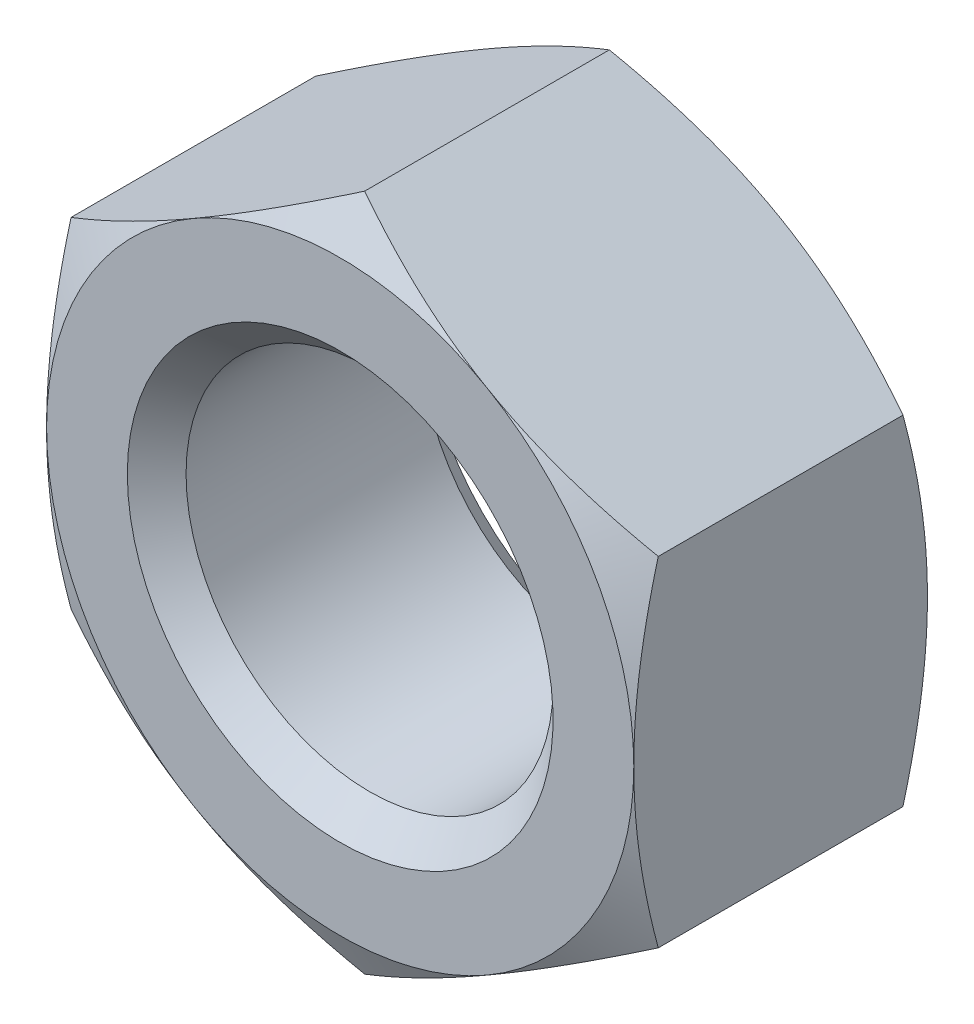
ISO-10303-21;
HEADER;
FILE_DESCRIPTION(('STEP AP214'),'2;1');
FILE_NAME('part.step','',(''),(''),'','','');
FILE_SCHEMA(('AUTOMOTIVE_DESIGN { 1 0 10303 214 1 1 1 1 }'));
ENDSEC;
DATA;
#1=APPLICATION_CONTEXT('core data for automotive mechanical design processes');
#2=APPLICATION_PROTOCOL_DEFINITION('international standard','automotive_design',2000,#1);
#3=PRODUCT_CONTEXT('',#1,'mechanical');
#4=PRODUCT('Part','Part','',(#3));
#5=PRODUCT_RELATED_PRODUCT_CATEGORY('part','',(#4));
#6=PRODUCT_DEFINITION_FORMATION('','',#4);
#7=PRODUCT_DEFINITION_CONTEXT('part definition',#1,'design');
#8=PRODUCT_DEFINITION('design','',#6,#7);
#9=PRODUCT_DEFINITION_SHAPE('','',#8);
#10=(LENGTH_UNIT() NAMED_UNIT(*) SI_UNIT(.MILLI.,.METRE.));
#11=(NAMED_UNIT(*) PLANE_ANGLE_UNIT() SI_UNIT($,.RADIAN.));
#12=(NAMED_UNIT(*) SI_UNIT($,.STERADIAN.) SOLID_ANGLE_UNIT());
#13=UNCERTAINTY_MEASURE_WITH_UNIT(LENGTH_MEASURE(1.E-05),#10,'distance_accuracy_value','');
#14=(GEOMETRIC_REPRESENTATION_CONTEXT(3) GLOBAL_UNCERTAINTY_ASSIGNED_CONTEXT((#13)) GLOBAL_UNIT_ASSIGNED_CONTEXT((#10,
#11,#12)) REPRESENTATION_CONTEXT('',''));
#15=CARTESIAN_POINT('',(0.,0.,0.));
#16=DIRECTION('',(0.,0.,1.));
#17=DIRECTION('',(1.,0.,0.));
#18=AXIS2_PLACEMENT_3D('',#15,#16,#17);
#19=CARTESIAN_POINT('',(0.,0.,4.));
#20=DIRECTION('',(0.,0.,1.));
#21=DIRECTION('',(1.,0.,0.));
#22=AXIS2_PLACEMENT_3D('',#19,#20,#21);
#23=PLANE('',#22);
#24=CARTESIAN_POINT('',(0.,0.,4.));
#25=DIRECTION('',(0.,0.,-1.));
#26=DIRECTION('',(-1.,0.,0.));
#27=AXIS2_PLACEMENT_3D('',#24,#25,#26);
#28=CIRCLE('',#27,2.9);
#29=CARTESIAN_POINT('',(-2.9,0.,4.));
#30=VERTEX_POINT('',#29);
#31=EDGE_CURVE('E160',#30,#30,#28,.T.);
#32=ORIENTED_EDGE('',*,*,#31,.T.);
#33=EDGE_LOOP('',(#32));
#34=FACE_BOUND('',#33,.T.);
#35=CARTESIAN_POINT('',(0.,0.,4.));
#36=DIRECTION('',(0.,0.,-1.));
#37=DIRECTION('',(-1.,0.,0.));
#38=AXIS2_PLACEMENT_3D('',#35,#36,#37);
#39=CIRCLE('',#38,4.);
#40=CARTESIAN_POINT('',(4.,0.,4.));
#41=VERTEX_POINT('',#40);
#42=CARTESIAN_POINT('',(2.,-3.46410161513776,4.));
#43=VERTEX_POINT('',#42);
#44=EDGE_CURVE('E304',#41,#43,#39,.T.);
#45=ORIENTED_EDGE('',*,*,#44,.F.);
#46=CARTESIAN_POINT('',(2.,3.46410161513775,4.));
#47=VERTEX_POINT('',#46);
#48=EDGE_CURVE('E306',#47,#41,#39,.T.);
#49=ORIENTED_EDGE('',*,*,#48,.F.);
#50=CARTESIAN_POINT('',(-2.,3.46410161513775,4.));
#51=VERTEX_POINT('',#50);
#52=EDGE_CURVE('E312',#51,#47,#39,.T.);
#53=ORIENTED_EDGE('',*,*,#52,.F.);
#54=CARTESIAN_POINT('',(-4.,0.,4.));
#55=VERTEX_POINT('',#54);
#56=EDGE_CURVE('E314',#55,#51,#39,.T.);
#57=ORIENTED_EDGE('',*,*,#56,.F.);
#58=CARTESIAN_POINT('',(-2.,-3.46410161513775,4.));
#59=VERTEX_POINT('',#58);
#60=EDGE_CURVE('E313',#59,#55,#39,.T.);
#61=ORIENTED_EDGE('',*,*,#60,.F.);
#62=EDGE_CURVE('E308',#43,#59,#39,.T.);
#63=ORIENTED_EDGE('',*,*,#62,.F.);
#64=EDGE_LOOP('',(#45,#49,#53,#57,#61,#63));
#65=FACE_BOUND('',#64,.T.);
#66=ADVANCED_FACE('F33',(#34,#65),#23,.T.);
#67=CARTESIAN_POINT('',(0.,0.,0.));
#68=DIRECTION('',(0.,0.,1.));
#69=DIRECTION('',(1.,0.,0.));
#70=AXIS2_PLACEMENT_3D('',#67,#68,#69);
#71=PLANE('',#70);
#72=CARTESIAN_POINT('',(0.,0.,0.));
#73=DIRECTION('',(0.,0.,-1.));
#74=DIRECTION('',(-1.,0.,0.));
#75=AXIS2_PLACEMENT_3D('',#72,#73,#74);
#76=CIRCLE('',#75,2.9);
#77=CARTESIAN_POINT('',(-2.9,0.,0.));
#78=VERTEX_POINT('',#77);
#79=EDGE_CURVE('E294',#78,#78,#76,.T.);
#80=ORIENTED_EDGE('',*,*,#79,.F.);
#81=EDGE_LOOP('',(#80));
#82=FACE_BOUND('',#81,.T.);
#83=CARTESIAN_POINT('',(0.,0.,0.));
#84=DIRECTION('',(0.,0.,-1.));
#85=DIRECTION('',(-1.,0.,0.));
#86=AXIS2_PLACEMENT_3D('',#83,#84,#85);
#87=CIRCLE('',#86,4.);
#88=CARTESIAN_POINT('',(2.,3.46410161513776,0.));
#89=VERTEX_POINT('',#88);
#90=CARTESIAN_POINT('',(4.,0.,0.));
#91=VERTEX_POINT('',#90);
#92=EDGE_CURVE('E356',#89,#91,#87,.T.);
#93=ORIENTED_EDGE('',*,*,#92,.T.);
#94=CARTESIAN_POINT('',(2.,-3.46410161513776,0.));
#95=VERTEX_POINT('',#94);
#96=EDGE_CURVE('E158',#91,#95,#87,.T.);
#97=ORIENTED_EDGE('',*,*,#96,.T.);
#98=CARTESIAN_POINT('',(-2.,-3.46410161513775,0.));
#99=VERTEX_POINT('',#98);
#100=EDGE_CURVE('E156',#95,#99,#87,.T.);
#101=ORIENTED_EDGE('',*,*,#100,.T.);
#102=CARTESIAN_POINT('',(-4.,0.,0.));
#103=VERTEX_POINT('',#102);
#104=EDGE_CURVE('E54',#99,#103,#87,.T.);
#105=ORIENTED_EDGE('',*,*,#104,.T.);
#106=CARTESIAN_POINT('',(-2.,3.46410161513775,0.));
#107=VERTEX_POINT('',#106);
#108=EDGE_CURVE('E130',#103,#107,#87,.T.);
#109=ORIENTED_EDGE('',*,*,#108,.T.);
#110=EDGE_CURVE('E137',#107,#89,#87,.T.);
#111=ORIENTED_EDGE('',*,*,#110,.T.);
#112=EDGE_LOOP('',(#93,#97,#101,#105,#109,#111));
#113=FACE_BOUND('',#112,.T.);
#114=ADVANCED_FACE('F154',(#82,#113),#71,.F.);
#115=CARTESIAN_POINT('',(-4.,-2.3094010767585,4.));
#116=DIRECTION('',(0.5,0.866025403784439,0.));
#117=DIRECTION('',(-0.866025403784439,0.5,0.));
#118=AXIS2_PLACEMENT_3D('',#115,#116,#117);
#119=PLANE('',#118);
#120=DIRECTION('',(0.,0.,-1.));
#121=VECTOR('',#120,1.);
#122=CARTESIAN_POINT('',(-4.,-2.3094010767585,4.));
#123=LINE('',#122,#121);
#124=CARTESIAN_POINT('',(-4.,-2.3094010767585,3.66666666666667));
#125=VERTEX_POINT('',#124);
#126=CARTESIAN_POINT('',(-4.,-2.3094010767585,0.333333333333333));
#127=VERTEX_POINT('',#126);
#128=EDGE_CURVE('E241',#125,#127,#123,.T.);
#129=ORIENTED_EDGE('',*,*,#128,.T.);
#130=CARTESIAN_POINT('',(-4.0002,-2.30928560670466,0.333395536512599));
#131=CARTESIAN_POINT('',(-3.82544343142338,-2.41018135861503,0.279023843196621));
#132=CARTESIAN_POINT('',(-3.64937399613057,-2.5118350944774,0.229608401689969));
#133=CARTESIAN_POINT('',(-3.29459567533502,-2.71666645349135,0.143312188818609));
#134=CARTESIAN_POINT('',(-3.11588215442706,-2.81984675289539,0.106457085569042));
#135=CARTESIAN_POINT('',(-2.76037977464407,-3.02509614756065,0.0487738588017574));
#136=CARTESIAN_POINT('',(-2.58363220310694,-3.12714140556623,0.0276180480037177));
#137=CARTESIAN_POINT('',(-2.22938827138522,-3.33166423490456,0.00195261477935686));
#138=CARTESIAN_POINT('',(-2.05189286991919,-3.43414125272089,-0.0025741301020054));
#139=CARTESIAN_POINT('',(-1.71767356485902,-3.62710285846574,0.00493896436130907));
#140=CARTESIAN_POINT('',(-1.56091561654162,-3.71760710212441,0.0151278787991774));
#141=CARTESIAN_POINT('',(-1.24828236106871,-3.89810599632933,0.0480626941169735));
#142=CARTESIAN_POINT('',(-1.09240785848224,-3.98810018235742,0.0708186133818323));
#143=CARTESIAN_POINT('',(-0.779187615647182,-4.16893797387388,0.127951453713286));
#144=CARTESIAN_POINT('',(-0.621872503303762,-4.25976389633295,0.162546437931521));
#145=CARTESIAN_POINT('',(-0.30930983110621,-4.44022203926484,0.241286173357489));
#146=CARTESIAN_POINT('',(-0.154059223150336,-4.52985601956002,0.285414666218662));
#147=CARTESIAN_POINT('',(0.000199999999999681,-4.61891762357084,0.3333955365126));
#148=B_SPLINE_CURVE_WITH_KNOTS('',3,(#130,#131,#132,#133,#134,#135,#136,#137,#138,#139,#140,
#141,#142,#143,#144,#145,#146,#147),.UNSPECIFIED.,.F.,.F.,(4,2,2,2,2,2,2,2,4),(0.,
0.627167133338425,1.25560835649169,1.8705318494423,2.48482199618759,3.02824583676971,
3.57210352015798,4.12657182752052,4.68010191140895),.UNSPECIFIED.);
#149=EDGE_CURVE('E142',#127,#99,#148,.T.);
#150=ORIENTED_EDGE('',*,*,#149,.T.);
#151=CARTESIAN_POINT('',(0.,-4.61880215351701,0.333333333333333));
#152=VERTEX_POINT('',#151);
#153=EDGE_CURVE('E207',#99,#152,#148,.T.);
#154=ORIENTED_EDGE('',*,*,#153,.T.);
#155=DIRECTION('',(0.,0.,-1.));
#156=VECTOR('',#155,1.);
#157=CARTESIAN_POINT('',(0.,-4.61880215351701,4.));
#158=LINE('',#157,#156);
#159=CARTESIAN_POINT('',(0.,-4.61880215351701,3.66666666666667));
#160=VERTEX_POINT('',#159);
#161=EDGE_CURVE('E252',#160,#152,#158,.T.);
#162=ORIENTED_EDGE('',*,*,#161,.F.);
#163=CARTESIAN_POINT('',(0.000200000000000024,-4.61891762357084,3.6666044634874));
#164=CARTESIAN_POINT('',(-0.174556568576619,-4.51802187166048,3.72097615680338));
#165=CARTESIAN_POINT('',(-0.350626003869434,-4.41636813579811,3.77039159831003));
#166=CARTESIAN_POINT('',(-0.705404324664975,-4.21153677678416,3.85668781118139));
#167=CARTESIAN_POINT('',(-0.884117845572943,-4.10835647738012,3.89354291443096));
#168=CARTESIAN_POINT('',(-1.23962022535593,-3.90310708271486,3.95122614119824));
#169=CARTESIAN_POINT('',(-1.41636779689306,-3.80106182470928,3.97238195199628));
#170=CARTESIAN_POINT('',(-1.77061172861478,-3.59653899537095,3.99804738522064));
#171=CARTESIAN_POINT('',(-1.94810713008081,-3.49406197755462,4.00257413010201));
#172=CARTESIAN_POINT('',(-2.28232643514098,-3.30110037180976,3.99506103563869));
#173=CARTESIAN_POINT('',(-2.43908438345838,-3.2105961281511,3.98487212120082));
#174=CARTESIAN_POINT('',(-2.75171763893129,-3.03009723394618,3.95193730588303));
#175=CARTESIAN_POINT('',(-2.90759214151776,-2.94010304791809,3.92918138661817));
#176=CARTESIAN_POINT('',(-3.22081238435282,-2.75926525640163,3.87204854628671));
#177=CARTESIAN_POINT('',(-3.37812749669624,-2.66843933394256,3.83745356206848));
#178=CARTESIAN_POINT('',(-3.69069016889379,-2.48798119101067,3.75871382664251));
#179=CARTESIAN_POINT('',(-3.84594077684966,-2.39834721071549,3.71458533378134));
#180=CARTESIAN_POINT('',(-4.0002,-2.30928560670466,3.6666044634874));
#181=B_SPLINE_CURVE_WITH_KNOTS('',3,(#163,#164,#165,#166,#167,#168,#169,#170,#171,#172,#173,
#174,#175,#176,#177,#178,#179,#180),.UNSPECIFIED.,.F.,.F.,(4,2,2,2,2,2,2,2,4),(0.,
0.627167133338425,1.25560835649169,1.8705318494423,2.48482199618759,3.02824583676971,
3.57210352015798,4.12657182752052,4.68010191140895),.UNSPECIFIED.);
#182=EDGE_CURVE('E327',#160,#59,#181,.T.);
#183=ORIENTED_EDGE('',*,*,#182,.T.);
#184=EDGE_CURVE('E321',#59,#125,#181,.T.);
#185=ORIENTED_EDGE('',*,*,#184,.T.);
#186=EDGE_LOOP('',(#129,#150,#154,#162,#183,#185));
#187=FACE_BOUND('',#186,.T.);
#188=ADVANCED_FACE('F35',(#187),#119,.F.);
#189=CARTESIAN_POINT('',(0.,-4.61880215351701,4.));
#190=DIRECTION('',(-0.5,0.866025403784439,0.));
#191=DIRECTION('',(-0.866025403784439,-0.5,0.));
#192=AXIS2_PLACEMENT_3D('',#189,#190,#191);
#193=PLANE('',#192);
#194=ORIENTED_EDGE('',*,*,#161,.T.);
#195=CARTESIAN_POINT('',(-0.000200000000000029,-4.61891762357084,0.3333955365126));
#196=CARTESIAN_POINT('',(0.17455656857662,-4.51802187166048,0.279023843196621));
#197=CARTESIAN_POINT('',(0.350626003869434,-4.41636813579811,0.229608401689969));
#198=CARTESIAN_POINT('',(0.705404324664975,-4.21153677678416,0.143312188818609));
#199=CARTESIAN_POINT('',(0.884117845572943,-4.10835647738011,0.106457085569042));
#200=CARTESIAN_POINT('',(1.23962022535593,-3.90310708271486,0.0487738588017579));
#201=CARTESIAN_POINT('',(1.41636779689306,-3.80106182470928,0.0276180480037185));
#202=CARTESIAN_POINT('',(1.77061172861478,-3.59653899537095,0.00195261477935759));
#203=CARTESIAN_POINT('',(1.94810713008081,-3.49406197755462,-0.00257413010200502));
#204=CARTESIAN_POINT('',(2.28232643514098,-3.30110037180977,0.00493896436130913));
#205=CARTESIAN_POINT('',(2.43908438345838,-3.2105961281511,0.0151278787991775));
#206=CARTESIAN_POINT('',(2.7517176389313,-3.03009723394618,0.0480626941169736));
#207=CARTESIAN_POINT('',(2.90759214151776,-2.94010304791809,0.0708186133818323));
#208=CARTESIAN_POINT('',(3.22081238435282,-2.75926525640163,0.127951453713286));
#209=CARTESIAN_POINT('',(3.37812749669624,-2.66843933394256,0.162546437931521));
#210=CARTESIAN_POINT('',(3.69069016889379,-2.48798119101067,0.241286173357489));
#211=CARTESIAN_POINT('',(3.84594077684966,-2.3983472107155,0.285414666218662));
#212=CARTESIAN_POINT('',(4.0002,-2.30928560670467,0.3333955365126));
#213=B_SPLINE_CURVE_WITH_KNOTS('',3,(#195,#196,#197,#198,#199,#200,#201,#202,#203,#204,#205,
#206,#207,#208,#209,#210,#211,#212),.UNSPECIFIED.,.F.,.F.,(4,2,2,2,2,2,2,2,4),(0.,
0.627167133338425,1.25560835649169,1.8705318494423,2.48482199618759,3.02824583676971,
3.57210352015798,4.12657182752052,4.68010191140895),.UNSPECIFIED.);
#214=EDGE_CURVE('E206',#152,#95,#213,.T.);
#215=ORIENTED_EDGE('',*,*,#214,.T.);
#216=CARTESIAN_POINT('',(4.,-2.3094010767585,0.333333333333333));
#217=VERTEX_POINT('',#216);
#218=EDGE_CURVE('E201',#95,#217,#213,.T.);
#219=ORIENTED_EDGE('',*,*,#218,.T.);
#220=DIRECTION('',(0.,0.,-1.));
#221=VECTOR('',#220,1.);
#222=CARTESIAN_POINT('',(4.,-2.3094010767585,4.));
#223=LINE('',#222,#221);
#224=CARTESIAN_POINT('',(4.,-2.3094010767585,3.66666666666667));
#225=VERTEX_POINT('',#224);
#226=EDGE_CURVE('E250',#225,#217,#223,.T.);
#227=ORIENTED_EDGE('',*,*,#226,.F.);
#228=CARTESIAN_POINT('',(4.0002,-2.30928560670467,3.6666044634874));
#229=CARTESIAN_POINT('',(3.82544343142338,-2.41018135861503,3.72097615680338));
#230=CARTESIAN_POINT('',(3.64937399613056,-2.51183509447741,3.77039159831003));
#231=CARTESIAN_POINT('',(3.29459567533502,-2.71666645349136,3.85668781118139));
#232=CARTESIAN_POINT('',(3.11588215442706,-2.8198467528954,3.89354291443096));
#233=CARTESIAN_POINT('',(2.76037977464407,-3.02509614756066,3.95122614119824));
#234=CARTESIAN_POINT('',(2.58363220310694,-3.12714140556623,3.97238195199628));
#235=CARTESIAN_POINT('',(2.22938827138522,-3.33166423490456,3.99804738522064));
#236=CARTESIAN_POINT('',(2.05189286991919,-3.43414125272089,4.002574130102));
#237=CARTESIAN_POINT('',(1.71767356485902,-3.62710285846575,3.99506103563869));
#238=CARTESIAN_POINT('',(1.56091561654162,-3.71760710212441,3.98487212120082));
#239=CARTESIAN_POINT('',(1.2482823610687,-3.89810599632933,3.95193730588303));
#240=CARTESIAN_POINT('',(1.09240785848224,-3.98810018235742,3.92918138661817));
#241=CARTESIAN_POINT('',(0.779187615647182,-4.16893797387388,3.87204854628671));
#242=CARTESIAN_POINT('',(0.621872503303762,-4.25976389633295,3.83745356206848));
#243=CARTESIAN_POINT('',(0.30930983110621,-4.44022203926484,3.75871382664251));
#244=CARTESIAN_POINT('',(0.154059223150336,-4.52985601956002,3.71458533378134));
#245=CARTESIAN_POINT('',(-0.000199999999999755,-4.61891762357084,3.6666044634874));
#246=B_SPLINE_CURVE_WITH_KNOTS('',3,(#228,#229,#230,#231,#232,#233,#234,#235,#236,#237,#238,
#239,#240,#241,#242,#243,#244,#245),.UNSPECIFIED.,.F.,.F.,(4,2,2,2,2,2,2,2,4),(0.,
0.627167133338426,1.25560835649169,1.8705318494423,2.48482199618759,3.02824583676971,
3.57210352015798,4.12657182752051,4.68010191140894),.UNSPECIFIED.);
#247=EDGE_CURVE('E227',#225,#43,#246,.T.);
#248=ORIENTED_EDGE('',*,*,#247,.T.);
#249=EDGE_CURVE('E220',#43,#160,#246,.T.);
#250=ORIENTED_EDGE('',*,*,#249,.T.);
#251=EDGE_LOOP('',(#194,#215,#219,#227,#248,#250));
#252=FACE_BOUND('',#251,.T.);
#253=ADVANCED_FACE('F212',(#252),#193,.F.);
#254=CARTESIAN_POINT('',(4.,-2.3094010767585,4.));
#255=DIRECTION('',(-1.,0.,0.));
#256=DIRECTION('',(0.,-1.,0.));
#257=AXIS2_PLACEMENT_3D('',#254,#255,#256);
#258=PLANE('',#257);
#259=ORIENTED_EDGE('',*,*,#226,.T.);
#260=CARTESIAN_POINT('',(4.,-6.12465606060113,1.78578859034952));
#261=CARTESIAN_POINT('',(4.,-5.94807272678306,1.70617076017397));
#262=CARTESIAN_POINT('',(4.,-5.77111437773541,1.62736962172036));
#263=CARTESIAN_POINT('',(4.,-5.41624686185262,1.47186426207372));
#264=CARTESIAN_POINT('',(4.,-5.23833755085189,1.39516037025972));
#265=CARTESIAN_POINT('',(4.,-4.88052144234326,1.2439574965174));
#266=CARTESIAN_POINT('',(4.,-4.70060909498336,1.16947160073948));
#267=CARTESIAN_POINT('',(4.,-4.33946420476368,1.0237846613623));
#268=CARTESIAN_POINT('',(4.,-4.15823172405733,0.952583464258251));
#269=CARTESIAN_POINT('',(4.,-3.79251879461095,0.813698662988814));
#270=CARTESIAN_POINT('',(4.,-3.6080237995005,0.746053155399669));
#271=CARTESIAN_POINT('',(4.,-3.23711156127834,0.61615488608717));
#272=CARTESIAN_POINT('',(4.,-3.05069413780278,0.553902635610596));
#273=CARTESIAN_POINT('',(4.,-2.6760277018865,0.43643135992104));
#274=CARTESIAN_POINT('',(4.,-2.48778289377823,0.381199059142228));
#275=CARTESIAN_POINT('',(4.,-2.10895429136712,0.279535341469906));
#276=CARTESIAN_POINT('',(4.,-1.91837114965874,0.233101525974141));
#277=CARTESIAN_POINT('',(4.,-1.5347598212881,0.151213238734758));
#278=CARTESIAN_POINT('',(4.,-1.34173094133917,0.115761956092511));
#279=CARTESIAN_POINT('',(4.,-0.95364837830096,0.0581148169951025));
#280=CARTESIAN_POINT('',(4.,-0.758594605555516,0.0359195500451328));
#281=CARTESIAN_POINT('',(4.,-0.368329490347497,0.00662630185783796));
#282=CARTESIAN_POINT('',(4.,-0.173124030914448,-0.000548140304414855));
#283=CARTESIAN_POINT('',(4.,0.217189649465562,0.000613513643077368));
#284=CARTESIAN_POINT('',(4.,0.412297882158566,0.00894507796775398));
#285=CARTESIAN_POINT('',(4.,0.758770311592138,0.0369241468082312));
#286=CARTESIAN_POINT('',(4.,0.91037798636888,0.053701463239071));
#287=CARTESIAN_POINT('',(4.,1.21248172184858,0.0954401006786356));
#288=CARTESIAN_POINT('',(4.,1.36297756793462,0.120402961611947));
#289=CARTESIAN_POINT('',(4.,1.66274837052041,0.177522439679809));
#290=CARTESIAN_POINT('',(4.,1.81202182875218,0.209686816202598));
#291=CARTESIAN_POINT('',(4.,2.10909736140954,0.280116855929456));
#292=CARTESIAN_POINT('',(4.,2.2568995370089,0.318382096480732));
#293=CARTESIAN_POINT('',(4.,2.55450258053101,0.400961452917501));
#294=CARTESIAN_POINT('',(4.,2.70426986908358,0.445395653954795));
#295=CARTESIAN_POINT('',(4.,3.00231082032815,0.538630452223047));
#296=CARTESIAN_POINT('',(4.,3.15058548979997,0.587427851355468));
#297=CARTESIAN_POINT('',(4.,3.44500555360459,0.688321047172834));
#298=CARTESIAN_POINT('',(4.,3.59115838834901,0.740395267271637));
#299=CARTESIAN_POINT('',(4.,3.88244574527926,0.847521971689482));
#300=CARTESIAN_POINT('',(4.,4.02757977693788,0.90257579253939));
#301=CARTESIAN_POINT('',(4.,4.17224291316199,0.958804969957559));
#302=B_SPLINE_CURVE_WITH_KNOTS('',3,(#260,#261,#262,#263,#264,#265,#266,#267,#268,#269,#270,
#271,#272,#273,#274,#275,#276,#277,#278,#279,#280,#281,#282,#283,#284,#285,#286,#287,#288,#289,
#290,#291,#292,#293,#294,#295,#296,#297,#298,#299,#300,#301),.UNSPECIFIED.,.F.,.F.,(4,2,2,2,2,2,
2,2,2,2,2,2,2,2,2,2,2,2,2,2,4),(0.,0.581114780286608,1.1623203082163,1.74645999055631,
2.33057234641384,2.92002320524669,3.50952987930703,4.09790459122561,4.68611867165817,
5.2745033975901,5.86291428749447,6.44832261736047,7.03355988266934,7.49092720644395,
7.94838062292147,8.40632932234503,8.86424630998788,9.33282419558873,9.80106139929137,
10.2664856243637,10.7321203790827),.UNSPECIFIED.);
#303=EDGE_CURVE('E62',#217,#91,#302,.T.);
#304=ORIENTED_EDGE('',*,*,#303,.T.);
#305=CARTESIAN_POINT('',(4.,2.3094010767585,0.333333333333333));
#306=VERTEX_POINT('',#305);
#307=EDGE_CURVE('E195',#91,#306,#302,.T.);
#308=ORIENTED_EDGE('',*,*,#307,.T.);
#309=DIRECTION('',(0.,0.,-1.));
#310=VECTOR('',#309,1.);
#311=CARTESIAN_POINT('',(4.,2.3094010767585,4.));
#312=LINE('',#311,#310);
#313=CARTESIAN_POINT('',(4.,2.3094010767585,3.66666666666667));
#314=VERTEX_POINT('',#313);
#315=EDGE_CURVE('E247',#314,#306,#312,.T.);
#316=ORIENTED_EDGE('',*,*,#315,.F.);
#317=CARTESIAN_POINT('',(4.,-6.12465606060113,2.21421140965048));
#318=CARTESIAN_POINT('',(4.,-5.94807272678306,2.29382923982603));
#319=CARTESIAN_POINT('',(4.,-5.77111437773541,2.37263037827964));
#320=CARTESIAN_POINT('',(4.,-5.41624686185261,2.52813573792628));
#321=CARTESIAN_POINT('',(4.,-5.23833755085189,2.60483962974028));
#322=CARTESIAN_POINT('',(4.,-4.88052144234326,2.7560425034826));
#323=CARTESIAN_POINT('',(4.,-4.70060909498336,2.83052839926052));
#324=CARTESIAN_POINT('',(4.,-4.33946420476367,2.9762153386377));
#325=CARTESIAN_POINT('',(4.,-4.15823172405732,3.04741653574175));
#326=CARTESIAN_POINT('',(4.,-3.79251879461095,3.18630133701119));
#327=CARTESIAN_POINT('',(4.,-3.6080237995005,3.25394684460033));
#328=CARTESIAN_POINT('',(4.,-3.23711156127834,3.38384511391283));
#329=CARTESIAN_POINT('',(4.,-3.05069413780278,3.4460973643894));
#330=CARTESIAN_POINT('',(4.,-2.6760277018865,3.56356864007896));
#331=CARTESIAN_POINT('',(4.,-2.48778289377823,3.61880094085777));
#332=CARTESIAN_POINT('',(4.,-2.10895429136712,3.72046465853009));
#333=CARTESIAN_POINT('',(4.,-1.91837114965873,3.76689847402586));
#334=CARTESIAN_POINT('',(4.,-1.5347598212881,3.84878676126524));
#335=CARTESIAN_POINT('',(4.,-1.34173094133917,3.88423804390749));
#336=CARTESIAN_POINT('',(4.,-0.953648378300959,3.9418851830049));
#337=CARTESIAN_POINT('',(4.,-0.758594605555515,3.96408044995487));
#338=CARTESIAN_POINT('',(4.,-0.368329490347496,3.99337369814216));
#339=CARTESIAN_POINT('',(4.,-0.173124030914448,4.00054814030442));
#340=CARTESIAN_POINT('',(4.,0.217189649465562,3.99938648635692));
#341=CARTESIAN_POINT('',(4.,0.412297882158566,3.99105492203225));
#342=CARTESIAN_POINT('',(4.,0.758770311592138,3.96307585319177));
#343=CARTESIAN_POINT('',(4.,0.91037798636888,3.94629853676093));
#344=CARTESIAN_POINT('',(4.,1.21248172184858,3.90455989932136));
#345=CARTESIAN_POINT('',(4.,1.36297756793462,3.87959703838805));
#346=CARTESIAN_POINT('',(4.,1.66274837052041,3.82247756032019));
#347=CARTESIAN_POINT('',(4.,1.81202182875218,3.7903131837974));
#348=CARTESIAN_POINT('',(4.,2.10909736140953,3.71988314407054));
#349=CARTESIAN_POINT('',(4.,2.2568995370089,3.68161790351927));
#350=CARTESIAN_POINT('',(4.,2.55450258053101,3.5990385470825));
#351=CARTESIAN_POINT('',(4.,2.70426986908359,3.5546043460452));
#352=CARTESIAN_POINT('',(4.,3.00231082032815,3.46136954777695));
#353=CARTESIAN_POINT('',(4.,3.15058548979997,3.41257214864453));
#354=CARTESIAN_POINT('',(4.,3.44500555360459,3.31167895282716));
#355=CARTESIAN_POINT('',(4.,3.59115838834901,3.25960473272836));
#356=CARTESIAN_POINT('',(4.,3.88244574527926,3.15247802831052));
#357=CARTESIAN_POINT('',(4.,4.02757977693788,3.09742420746061));
#358=CARTESIAN_POINT('',(4.,4.17224291316199,3.04119503004244));
#359=B_SPLINE_CURVE_WITH_KNOTS('',3,(#317,#318,#319,#320,#321,#322,#323,#324,#325,#326,#327,
#328,#329,#330,#331,#332,#333,#334,#335,#336,#337,#338,#339,#340,#341,#342,#343,#344,#345,#346,
#347,#348,#349,#350,#351,#352,#353,#354,#355,#356,#357,#358),.UNSPECIFIED.,.F.,.F.,(4,2,2,2,2,2,
2,2,2,2,2,2,2,2,2,2,2,2,2,2,4),(0.,0.581114780286609,1.1623203082163,1.74645999055632,
2.33057234641384,2.92002320524669,3.50952987930704,4.09790459122561,4.68611867165817,
5.2745033975901,5.86291428749447,6.44832261736047,7.03355988266934,7.49092720644395,
7.94838062292147,8.40632932234503,8.86424630998788,9.33282419558873,9.80106139929136,
10.2664856243637,10.7321203790827),.UNSPECIFIED.);
#360=EDGE_CURVE('E239',#314,#41,#359,.F.);
#361=ORIENTED_EDGE('',*,*,#360,.T.);
#362=EDGE_CURVE('E233',#41,#225,#359,.F.);
#363=ORIENTED_EDGE('',*,*,#362,.T.);
#364=EDGE_LOOP('',(#259,#304,#308,#316,#361,#363));
#365=FACE_BOUND('',#364,.T.);
#366=ADVANCED_FACE('F215',(#365),#258,.F.);
#367=CARTESIAN_POINT('',(4.,2.3094010767585,4.));
#368=DIRECTION('',(-0.5,-0.866025403784439,0.));
#369=DIRECTION('',(0.866025403784439,-0.5,0.));
#370=AXIS2_PLACEMENT_3D('',#367,#368,#369);
#371=PLANE('',#370);
#372=ORIENTED_EDGE('',*,*,#315,.T.);
#373=CARTESIAN_POINT('',(4.0002,2.30928560670467,0.3333955365126));
#374=CARTESIAN_POINT('',(3.82544343142338,2.41018135861503,0.279023843196621));
#375=CARTESIAN_POINT('',(3.64937399613057,2.5118350944774,0.229608401689969));
#376=CARTESIAN_POINT('',(3.29459567533502,2.71666645349135,0.143312188818609));
#377=CARTESIAN_POINT('',(3.11588215442706,2.81984675289539,0.106457085569042));
#378=CARTESIAN_POINT('',(2.76037977464407,3.02509614756065,0.0487738588017579));
#379=CARTESIAN_POINT('',(2.58363220310694,3.12714140556623,0.0276180480037182));
#380=CARTESIAN_POINT('',(2.22938827138522,3.33166423490456,0.00195261477935735));
#381=CARTESIAN_POINT('',(2.05189286991919,3.43414125272089,-0.00257413010200486));
#382=CARTESIAN_POINT('',(1.71767356485902,3.62710285846575,0.00493896436130926));
#383=CARTESIAN_POINT('',(1.56091561654162,3.71760710212441,0.0151278787991773));
#384=CARTESIAN_POINT('',(1.2482823610687,3.89810599632933,0.0480626941169733));
#385=CARTESIAN_POINT('',(1.09240785848224,3.98810018235742,0.0708186133818325));
#386=CARTESIAN_POINT('',(0.779187615647181,4.16893797387388,0.127951453713286));
#387=CARTESIAN_POINT('',(0.621872503303761,4.25976389633295,0.162546437931521));
#388=CARTESIAN_POINT('',(0.309309831106209,4.44022203926484,0.241286173357489));
#389=CARTESIAN_POINT('',(0.154059223150335,4.52985601956002,0.285414666218662));
#390=CARTESIAN_POINT('',(-0.000200000000000109,4.61891762357084,0.3333955365126));
#391=B_SPLINE_CURVE_WITH_KNOTS('',3,(#373,#374,#375,#376,#377,#378,#379,#380,#381,#382,#383,
#384,#385,#386,#387,#388,#389,#390),.UNSPECIFIED.,.F.,.F.,(4,2,2,2,2,2,2,2,4),(0.,
0.627167133338425,1.25560835649169,1.8705318494423,2.48482199618759,3.02824583676971,
3.57210352015798,4.12657182752052,4.68010191140895),.UNSPECIFIED.);
#392=EDGE_CURVE('E363',#306,#89,#391,.T.);
#393=ORIENTED_EDGE('',*,*,#392,.T.);
#394=CARTESIAN_POINT('',(0.,4.61880215351701,0.333333333333333));
#395=VERTEX_POINT('',#394);
#396=EDGE_CURVE('E170',#89,#395,#391,.T.);
#397=ORIENTED_EDGE('',*,*,#396,.T.);
#398=DIRECTION('',(0.,0.,-1.));
#399=VECTOR('',#398,1.);
#400=CARTESIAN_POINT('',(0.,4.61880215351701,4.));
#401=LINE('',#400,#399);
#402=CARTESIAN_POINT('',(0.,4.61880215351701,3.66666666666667));
#403=VERTEX_POINT('',#402);
#404=EDGE_CURVE('E244',#403,#395,#401,.T.);
#405=ORIENTED_EDGE('',*,*,#404,.F.);
#406=CARTESIAN_POINT('',(-0.000200000000000422,4.61891762357084,3.6666044634874));
#407=CARTESIAN_POINT('',(0.174556568576619,4.51802187166048,3.72097615680338));
#408=CARTESIAN_POINT('',(0.350626003869434,4.41636813579811,3.77039159831003));
#409=CARTESIAN_POINT('',(0.705404324664975,4.21153677678416,3.85668781118139));
#410=CARTESIAN_POINT('',(0.884117845572943,4.10835647738011,3.89354291443096));
#411=CARTESIAN_POINT('',(1.23962022535593,3.90310708271486,3.95122614119824));
#412=CARTESIAN_POINT('',(1.41636779689306,3.80106182470928,3.97238195199628));
#413=CARTESIAN_POINT('',(1.77061172861478,3.59653899537095,3.99804738522064));
#414=CARTESIAN_POINT('',(1.94810713008081,3.49406197755462,4.002574130102));
#415=CARTESIAN_POINT('',(2.28232643514098,3.30110037180977,3.99506103563869));
#416=CARTESIAN_POINT('',(2.43908438345838,3.2105961281511,3.98487212120082));
#417=CARTESIAN_POINT('',(2.75171763893129,3.03009723394618,3.95193730588303));
#418=CARTESIAN_POINT('',(2.90759214151776,2.94010304791809,3.92918138661817));
#419=CARTESIAN_POINT('',(3.22081238435282,2.75926525640163,3.87204854628671));
#420=CARTESIAN_POINT('',(3.37812749669624,2.66843933394256,3.83745356206848));
#421=CARTESIAN_POINT('',(3.69069016889379,2.48798119101067,3.75871382664251));
#422=CARTESIAN_POINT('',(3.84594077684966,2.39834721071549,3.71458533378134));
#423=CARTESIAN_POINT('',(4.0002,2.30928560670467,3.6666044634874));
#424=B_SPLINE_CURVE_WITH_KNOTS('',3,(#406,#407,#408,#409,#410,#411,#412,#413,#414,#415,#416,
#417,#418,#419,#420,#421,#422,#423),.UNSPECIFIED.,.F.,.F.,(4,2,2,2,2,2,2,2,4),(0.,
0.627167133338425,1.25560835649169,1.8705318494423,2.48482199618759,3.02824583676971,
3.57210352015798,4.12657182752052,4.68010191140895),.UNSPECIFIED.);
#425=EDGE_CURVE('E228',#403,#47,#424,.T.);
#426=ORIENTED_EDGE('',*,*,#425,.T.);
#427=EDGE_CURVE('E240',#47,#314,#424,.T.);
#428=ORIENTED_EDGE('',*,*,#427,.T.);
#429=EDGE_LOOP('',(#372,#393,#397,#405,#426,#428));
#430=FACE_BOUND('',#429,.T.);
#431=ADVANCED_FACE('F364',(#430),#371,.F.);
#432=CARTESIAN_POINT('',(0.,4.61880215351701,4.));
#433=DIRECTION('',(0.5,-0.866025403784439,0.));
#434=DIRECTION('',(0.866025403784439,0.5,0.));
#435=AXIS2_PLACEMENT_3D('',#432,#433,#434);
#436=PLANE('',#435);
#437=ORIENTED_EDGE('',*,*,#404,.T.);
#438=CARTESIAN_POINT('',(0.000199999999999631,4.61891762357084,0.3333955365126));
#439=CARTESIAN_POINT('',(-0.17455656857662,4.51802187166048,0.279023843196621));
#440=CARTESIAN_POINT('',(-0.350626003869435,4.41636813579811,0.22960840168997));
#441=CARTESIAN_POINT('',(-0.705404324664975,4.21153677678416,0.14331218881861));
#442=CARTESIAN_POINT('',(-0.884117845572944,4.10835647738011,0.106457085569043));
#443=CARTESIAN_POINT('',(-1.23962022535593,3.90310708271486,0.0487738588017583));
#444=CARTESIAN_POINT('',(-1.41636779689306,3.80106182470928,0.0276180480037187));
#445=CARTESIAN_POINT('',(-1.77061172861478,3.59653899537095,0.00195261477935762));
#446=CARTESIAN_POINT('',(-1.94810713008081,3.49406197755462,-0.002574130102005));
#447=CARTESIAN_POINT('',(-2.28232643514098,3.30110037180976,0.00493896436130914));
#448=CARTESIAN_POINT('',(-2.43908438345838,3.2105961281511,0.0151278787991775));
#449=CARTESIAN_POINT('',(-2.7517176389313,3.03009723394618,0.0480626941169737));
#450=CARTESIAN_POINT('',(-2.90759214151776,2.94010304791809,0.0708186133818326));
#451=CARTESIAN_POINT('',(-3.22081238435282,2.75926525640163,0.127951453713286));
#452=CARTESIAN_POINT('',(-3.37812749669624,2.66843933394256,0.162546437931521));
#453=CARTESIAN_POINT('',(-3.69069016889379,2.48798119101067,0.241286173357489));
#454=CARTESIAN_POINT('',(-3.84594077684967,2.3983472107155,0.285414666218663));
#455=CARTESIAN_POINT('',(-4.0002,2.30928560670467,0.3333955365126));
#456=B_SPLINE_CURVE_WITH_KNOTS('',3,(#438,#439,#440,#441,#442,#443,#444,#445,#446,#447,#448,
#449,#450,#451,#452,#453,#454,#455),.UNSPECIFIED.,.F.,.F.,(4,2,2,2,2,2,2,2,4),(0.,
0.627167133338425,1.25560835649169,1.8705318494423,2.48482199618759,3.02824583676971,
3.57210352015799,4.12657182752052,4.68010191140895),.UNSPECIFIED.);
#457=EDGE_CURVE('E169',#395,#107,#456,.T.);
#458=ORIENTED_EDGE('',*,*,#457,.T.);
#459=CARTESIAN_POINT('',(-4.,2.3094010767585,0.333333333333333));
#460=VERTEX_POINT('',#459);
#461=EDGE_CURVE('E133',#107,#460,#456,.T.);
#462=ORIENTED_EDGE('',*,*,#461,.T.);
#463=DIRECTION('',(0.,0.,-1.));
#464=VECTOR('',#463,1.);
#465=CARTESIAN_POINT('',(-4.,2.3094010767585,4.));
#466=LINE('',#465,#464);
#467=CARTESIAN_POINT('',(-4.,2.3094010767585,3.66666666666667));
#468=VERTEX_POINT('',#467);
#469=EDGE_CURVE('E151',#468,#460,#466,.T.);
#470=ORIENTED_EDGE('',*,*,#469,.F.);
#471=CARTESIAN_POINT('',(-4.0002,2.30928560670467,3.6666044634874));
#472=CARTESIAN_POINT('',(-3.82544343142338,2.41018135861503,3.72097615680338));
#473=CARTESIAN_POINT('',(-3.64937399613057,2.51183509447741,3.77039159831003));
#474=CARTESIAN_POINT('',(-3.29459567533502,2.71666645349135,3.85668781118139));
#475=CARTESIAN_POINT('',(-3.11588215442706,2.8198467528954,3.89354291443096));
#476=CARTESIAN_POINT('',(-2.76037977464407,3.02509614756066,3.95122614119824));
#477=CARTESIAN_POINT('',(-2.58363220310694,3.12714140556623,3.97238195199628));
#478=CARTESIAN_POINT('',(-2.22938827138522,3.33166423490456,3.99804738522064));
#479=CARTESIAN_POINT('',(-2.05189286991919,3.43414125272089,4.002574130102));
#480=CARTESIAN_POINT('',(-1.71767356485902,3.62710285846575,3.99506103563869));
#481=CARTESIAN_POINT('',(-1.56091561654162,3.71760710212441,3.98487212120082));
#482=CARTESIAN_POINT('',(-1.24828236106871,3.89810599632933,3.95193730588303));
#483=CARTESIAN_POINT('',(-1.09240785848224,3.98810018235742,3.92918138661817));
#484=CARTESIAN_POINT('',(-0.779187615647182,4.16893797387388,3.87204854628671));
#485=CARTESIAN_POINT('',(-0.621872503303763,4.25976389633295,3.83745356206848));
#486=CARTESIAN_POINT('',(-0.309309831106211,4.44022203926484,3.75871382664251));
#487=CARTESIAN_POINT('',(-0.154059223150336,4.52985601956002,3.71458533378134));
#488=CARTESIAN_POINT('',(0.000199999999999473,4.61891762357084,3.6666044634874));
#489=B_SPLINE_CURVE_WITH_KNOTS('',3,(#471,#472,#473,#474,#475,#476,#477,#478,#479,#480,#481,
#482,#483,#484,#485,#486,#487,#488),.UNSPECIFIED.,.F.,.F.,(4,2,2,2,2,2,2,2,4),(0.,
0.627167133338426,1.25560835649169,1.8705318494423,2.48482199618759,3.02824583676971,
3.57210352015798,4.12657182752052,4.68010191140895),.UNSPECIFIED.);
#490=EDGE_CURVE('E316',#468,#51,#489,.T.);
#491=ORIENTED_EDGE('',*,*,#490,.T.);
#492=EDGE_CURVE('E322',#51,#403,#489,.T.);
#493=ORIENTED_EDGE('',*,*,#492,.T.);
#494=EDGE_LOOP('',(#437,#458,#462,#470,#491,#493));
#495=FACE_BOUND('',#494,.T.);
#496=ADVANCED_FACE('F176',(#495),#436,.F.);
#497=CARTESIAN_POINT('',(-4.,2.3094010767585,4.));
#498=DIRECTION('',(1.,0.,0.));
#499=DIRECTION('',(0.,0.,-1.));
#500=AXIS2_PLACEMENT_3D('',#497,#498,#499);
#501=PLANE('',#500);
#502=ORIENTED_EDGE('',*,*,#469,.T.);
#503=CARTESIAN_POINT('',(-4.,-6.12465606060113,1.78578859034952));
#504=CARTESIAN_POINT('',(-4.,-5.94807272678306,1.70617076017397));
#505=CARTESIAN_POINT('',(-4.,-5.77111437773541,1.62736962172036));
#506=CARTESIAN_POINT('',(-4.,-5.41624686185261,1.47186426207372));
#507=CARTESIAN_POINT('',(-4.,-5.23833755085189,1.39516037025971));
#508=CARTESIAN_POINT('',(-4.,-4.88052144234326,1.2439574965174));
#509=CARTESIAN_POINT('',(-4.,-4.70060909498336,1.16947160073948));
#510=CARTESIAN_POINT('',(-4.,-4.33946420476367,1.0237846613623));
#511=CARTESIAN_POINT('',(-4.,-4.15823172405732,0.95258346425825));
#512=CARTESIAN_POINT('',(-4.,-3.79251879461095,0.813698662988813));
#513=CARTESIAN_POINT('',(-4.,-3.6080237995005,0.746053155399669));
#514=CARTESIAN_POINT('',(-4.,-3.23711156127834,0.61615488608717));
#515=CARTESIAN_POINT('',(-4.,-3.05069413780278,0.553902635610596));
#516=CARTESIAN_POINT('',(-4.,-2.6760277018865,0.436431359921039));
#517=CARTESIAN_POINT('',(-4.,-2.48778289377823,0.381199059142228));
#518=CARTESIAN_POINT('',(-4.,-2.10895429136712,0.279535341469906));
#519=CARTESIAN_POINT('',(-4.,-1.91837114965873,0.233101525974141));
#520=CARTESIAN_POINT('',(-4.,-1.5347598212881,0.151213238734758));
#521=CARTESIAN_POINT('',(-4.,-1.34173094133917,0.115761956092511));
#522=CARTESIAN_POINT('',(-4.,-0.953648378300958,0.0581148169951025));
#523=CARTESIAN_POINT('',(-4.,-0.758594605555514,0.035919550045133));
#524=CARTESIAN_POINT('',(-4.,-0.368329490347495,0.00662630185783833));
#525=CARTESIAN_POINT('',(-4.,-0.173124030914446,-0.000548140304414636));
#526=CARTESIAN_POINT('',(-4.,0.217189649465564,0.000613513643077647));
#527=CARTESIAN_POINT('',(-4.,0.412297882158568,0.00894507796775449));
#528=CARTESIAN_POINT('',(-4.,0.75877031159214,0.0369241468082319));
#529=CARTESIAN_POINT('',(-4.,0.910377986368882,0.0537014632390717));
#530=CARTESIAN_POINT('',(-4.,1.21248172184858,0.0954401006786361));
#531=CARTESIAN_POINT('',(-4.,1.36297756793462,0.120402961611947));
#532=CARTESIAN_POINT('',(-4.,1.66274837052042,0.177522439679809));
#533=CARTESIAN_POINT('',(-4.,1.81202182875219,0.209686816202598));
#534=CARTESIAN_POINT('',(-4.,2.10909736140954,0.280116855929457));
#535=CARTESIAN_POINT('',(-4.,2.2568995370089,0.318382096480733));
#536=CARTESIAN_POINT('',(-4.,2.55450258053102,0.400961452917502));
#537=CARTESIAN_POINT('',(-4.,2.70426986908359,0.445395653954796));
#538=CARTESIAN_POINT('',(-4.,3.00231082032816,0.538630452223048));
#539=CARTESIAN_POINT('',(-4.,3.15058548979998,0.58742785135547));
#540=CARTESIAN_POINT('',(-4.,3.44500555360459,0.688321047172837));
#541=CARTESIAN_POINT('',(-4.,3.59115838834902,0.74039526727164));
#542=CARTESIAN_POINT('',(-4.,3.88244574527926,0.847521971689484));
#543=CARTESIAN_POINT('',(-4.,4.02757977693789,0.902575792539392));
#544=CARTESIAN_POINT('',(-4.,4.172242913162,0.958804969957561));
#545=B_SPLINE_CURVE_WITH_KNOTS('',3,(#503,#504,#505,#506,#507,#508,#509,#510,#511,#512,#513,
#514,#515,#516,#517,#518,#519,#520,#521,#522,#523,#524,#525,#526,#527,#528,#529,#530,#531,#532,
#533,#534,#535,#536,#537,#538,#539,#540,#541,#542,#543,#544),.UNSPECIFIED.,.F.,.F.,(4,2,2,2,2,2,
2,2,2,2,2,2,2,2,2,2,2,2,2,2,4),(0.,0.58111478028661,1.1623203082163,1.74645999055632,
2.33057234641384,2.92002320524669,3.50952987930704,4.09790459122561,4.68611867165817,
5.2745033975901,5.86291428749447,6.44832261736047,7.03355988266934,7.49092720644395,
7.94838062292147,8.40632932234503,8.86424630998788,9.33282419558874,9.80106139929137,
10.2664856243637,10.7321203790827),.UNSPECIFIED.);
#546=EDGE_CURVE('E11',#460,#103,#545,.F.);
#547=ORIENTED_EDGE('',*,*,#546,.T.);
#548=EDGE_CURVE('E38',#103,#127,#545,.F.);
#549=ORIENTED_EDGE('',*,*,#548,.T.);
#550=ORIENTED_EDGE('',*,*,#128,.F.);
#551=CARTESIAN_POINT('',(-4.,-6.12465606060113,2.21421140965048));
#552=CARTESIAN_POINT('',(-4.,-5.94807272678306,2.29382923982602));
#553=CARTESIAN_POINT('',(-4.,-5.77111437773541,2.37263037827964));
#554=CARTESIAN_POINT('',(-4.,-5.41624686185261,2.52813573792628));
#555=CARTESIAN_POINT('',(-4.,-5.23833755085189,2.60483962974029));
#556=CARTESIAN_POINT('',(-4.,-4.88052144234326,2.7560425034826));
#557=CARTESIAN_POINT('',(-4.,-4.70060909498336,2.83052839926052));
#558=CARTESIAN_POINT('',(-4.,-4.33946420476367,2.9762153386377));
#559=CARTESIAN_POINT('',(-4.,-4.15823172405732,3.04741653574175));
#560=CARTESIAN_POINT('',(-4.,-3.79251879461094,3.18630133701119));
#561=CARTESIAN_POINT('',(-4.,-3.6080237995005,3.25394684460033));
#562=CARTESIAN_POINT('',(-4.,-3.23711156127834,3.38384511391283));
#563=CARTESIAN_POINT('',(-4.,-3.05069413780278,3.4460973643894));
#564=CARTESIAN_POINT('',(-4.,-2.6760277018865,3.56356864007896));
#565=CARTESIAN_POINT('',(-4.,-2.48778289377823,3.61880094085777));
#566=CARTESIAN_POINT('',(-4.,-2.10895429136711,3.72046465853009));
#567=CARTESIAN_POINT('',(-4.,-1.91837114965873,3.76689847402586));
#568=CARTESIAN_POINT('',(-4.,-1.5347598212881,3.84878676126524));
#569=CARTESIAN_POINT('',(-4.,-1.34173094133917,3.88423804390749));
#570=CARTESIAN_POINT('',(-4.,-0.953648378300957,3.9418851830049));
#571=CARTESIAN_POINT('',(-4.,-0.758594605555514,3.96408044995487));
#572=CARTESIAN_POINT('',(-4.,-0.368329490347495,3.99337369814216));
#573=CARTESIAN_POINT('',(-4.,-0.173124030914446,4.00054814030441));
#574=CARTESIAN_POINT('',(-4.,0.217189649465564,3.99938648635692));
#575=CARTESIAN_POINT('',(-4.,0.412297882158568,3.99105492203225));
#576=CARTESIAN_POINT('',(-4.,0.75877031159214,3.96307585319177));
#577=CARTESIAN_POINT('',(-4.,0.910377986368882,3.94629853676093));
#578=CARTESIAN_POINT('',(-4.,1.21248172184859,3.90455989932136));
#579=CARTESIAN_POINT('',(-4.,1.36297756793462,3.87959703838805));
#580=CARTESIAN_POINT('',(-4.,1.66274837052042,3.82247756032019));
#581=CARTESIAN_POINT('',(-4.,1.81202182875219,3.7903131837974));
#582=CARTESIAN_POINT('',(-4.,2.10909736140954,3.71988314407054));
#583=CARTESIAN_POINT('',(-4.,2.2568995370089,3.68161790351927));
#584=CARTESIAN_POINT('',(-4.,2.55450258053102,3.5990385470825));
#585=CARTESIAN_POINT('',(-4.,2.70426986908359,3.5546043460452));
#586=CARTESIAN_POINT('',(-4.,3.00231082032816,3.46136954777695));
#587=CARTESIAN_POINT('',(-4.,3.15058548979998,3.41257214864453));
#588=CARTESIAN_POINT('',(-4.,3.44500555360459,3.31167895282716));
#589=CARTESIAN_POINT('',(-4.,3.59115838834902,3.25960473272836));
#590=CARTESIAN_POINT('',(-4.,3.88244574527926,3.15247802831052));
#591=CARTESIAN_POINT('',(-4.,4.02757977693789,3.09742420746061));
#592=CARTESIAN_POINT('',(-4.,4.17224291316199,3.04119503004244));
#593=B_SPLINE_CURVE_WITH_KNOTS('',3,(#551,#552,#553,#554,#555,#556,#557,#558,#559,#560,#561,
#562,#563,#564,#565,#566,#567,#568,#569,#570,#571,#572,#573,#574,#575,#576,#577,#578,#579,#580,
#581,#582,#583,#584,#585,#586,#587,#588,#589,#590,#591,#592),.UNSPECIFIED.,.F.,.F.,(4,2,2,2,2,2,
2,2,2,2,2,2,2,2,2,2,2,2,2,2,4),(0.,0.581114780286609,1.16232030821631,1.74645999055632,
2.33057234641384,2.92002320524669,3.50952987930704,4.09790459122561,4.68611867165817,
5.2745033975901,5.86291428749447,6.44832261736047,7.03355988266934,7.49092720644395,
7.94838062292148,8.40632932234503,8.86424630998788,9.33282419558873,9.80106139929137,
10.2664856243637,10.7321203790827),.UNSPECIFIED.);
#594=EDGE_CURVE('E146',#125,#55,#593,.T.);
#595=ORIENTED_EDGE('',*,*,#594,.T.);
#596=EDGE_CURVE('E254',#55,#468,#593,.T.);
#597=ORIENTED_EDGE('',*,*,#596,.T.);
#598=EDGE_LOOP('',(#502,#547,#549,#550,#595,#597));
#599=FACE_BOUND('',#598,.T.);
#600=ADVANCED_FACE('F148',(#599),#501,.F.);
#601=CARTESIAN_POINT('',(0.,0.,4.));
#602=DIRECTION('',(0.,0.,-1.));
#603=DIRECTION('',(-1.,0.,0.));
#604=AXIS2_PLACEMENT_3D('',#601,#602,#603);
#605=CYLINDRICAL_SURFACE('',#604,2.5);
#606=CARTESIAN_POINT('',(0.,0.,0.4));
#607=DIRECTION('',(0.,0.,-1.));
#608=DIRECTION('',(-1.,0.,0.));
#609=AXIS2_PLACEMENT_3D('',#606,#607,#608);
#610=CIRCLE('',#609,2.5);
#611=CARTESIAN_POINT('',(-2.5,0.,0.4));
#612=VERTEX_POINT('',#611);
#613=EDGE_CURVE('E279',#612,#612,#610,.T.);
#614=ORIENTED_EDGE('',*,*,#613,.T.);
#615=EDGE_LOOP('',(#614));
#616=FACE_BOUND('',#615,.T.);
#617=CARTESIAN_POINT('',(0.,0.,3.6));
#618=DIRECTION('',(0.,0.,-1.));
#619=DIRECTION('',(-1.,0.,0.));
#620=AXIS2_PLACEMENT_3D('',#617,#618,#619);
#621=CIRCLE('',#620,2.5);
#622=CARTESIAN_POINT('',(-2.5,0.,3.6));
#623=VERTEX_POINT('',#622);
#624=EDGE_CURVE('E157',#623,#623,#621,.T.);
#625=ORIENTED_EDGE('',*,*,#624,.F.);
#626=EDGE_LOOP('',(#625));
#627=FACE_BOUND('',#626,.T.);
#628=ADVANCED_FACE('F261',(#616,#627),#605,.F.);
#629=CARTESIAN_POINT('',(0.,0.,4.));
#630=DIRECTION('',(0.,0.,-1.));
#631=DIRECTION('',(-1.,0.,0.));
#632=AXIS2_PLACEMENT_3D('',#629,#630,#631);
#633=CONICAL_SURFACE('',#632,4.,1.07668938664621);
#634=ORIENTED_EDGE('',*,*,#596,.F.);
#635=ORIENTED_EDGE('',*,*,#56,.T.);
#636=ORIENTED_EDGE('',*,*,#490,.F.);
#637=EDGE_LOOP('',(#634,#635,#636));
#638=FACE_BOUND('',#637,.T.);
#639=ADVANCED_FACE('F269',(#638),#633,.T.);
#640=ORIENTED_EDGE('',*,*,#60,.T.);
#641=ORIENTED_EDGE('',*,*,#594,.F.);
#642=ORIENTED_EDGE('',*,*,#184,.F.);
#643=EDGE_LOOP('',(#640,#641,#642));
#644=FACE_BOUND('',#643,.T.);
#645=ADVANCED_FACE('F274',(#644),#633,.T.);
#646=ORIENTED_EDGE('',*,*,#492,.F.);
#647=ORIENTED_EDGE('',*,*,#52,.T.);
#648=ORIENTED_EDGE('',*,*,#425,.F.);
#649=EDGE_LOOP('',(#646,#647,#648));
#650=FACE_BOUND('',#649,.T.);
#651=ADVANCED_FACE('F347',(#650),#633,.T.);
#652=ORIENTED_EDGE('',*,*,#427,.F.);
#653=ORIENTED_EDGE('',*,*,#48,.T.);
#654=ORIENTED_EDGE('',*,*,#360,.F.);
#655=EDGE_LOOP('',(#652,#653,#654));
#656=FACE_BOUND('',#655,.T.);
#657=ADVANCED_FACE('F186',(#656),#633,.T.);
#658=ORIENTED_EDGE('',*,*,#44,.T.);
#659=ORIENTED_EDGE('',*,*,#247,.F.);
#660=ORIENTED_EDGE('',*,*,#362,.F.);
#661=EDGE_LOOP('',(#658,#659,#660));
#662=FACE_BOUND('',#661,.T.);
#663=ADVANCED_FACE('F342',(#662),#633,.T.);
#664=ORIENTED_EDGE('',*,*,#62,.T.);
#665=ORIENTED_EDGE('',*,*,#182,.F.);
#666=ORIENTED_EDGE('',*,*,#249,.F.);
#667=EDGE_LOOP('',(#664,#665,#666));
#668=FACE_BOUND('',#667,.T.);
#669=ADVANCED_FACE('F182',(#668),#633,.T.);
#670=CARTESIAN_POINT('',(0.,0.,0.333333333333333));
#671=DIRECTION('',(0.,0.,1.));
#672=DIRECTION('',(1.,0.,0.));
#673=AXIS2_PLACEMENT_3D('',#670,#671,#672);
#674=CONICAL_SURFACE('',#673,4.61880215351701,1.07668938664621);
#675=ORIENTED_EDGE('',*,*,#548,.F.);
#676=ORIENTED_EDGE('',*,*,#104,.F.);
#677=ORIENTED_EDGE('',*,*,#149,.F.);
#678=EDGE_LOOP('',(#675,#676,#677));
#679=FACE_BOUND('',#678,.T.);
#680=ADVANCED_FACE('F140',(#679),#674,.T.);
#681=ORIENTED_EDGE('',*,*,#108,.F.);
#682=ORIENTED_EDGE('',*,*,#546,.F.);
#683=ORIENTED_EDGE('',*,*,#461,.F.);
#684=EDGE_LOOP('',(#681,#682,#683));
#685=FACE_BOUND('',#684,.T.);
#686=ADVANCED_FACE('F131',(#685),#674,.T.);
#687=ORIENTED_EDGE('',*,*,#110,.F.);
#688=ORIENTED_EDGE('',*,*,#457,.F.);
#689=ORIENTED_EDGE('',*,*,#396,.F.);
#690=EDGE_LOOP('',(#687,#688,#689));
#691=FACE_BOUND('',#690,.T.);
#692=ADVANCED_FACE('F360',(#691),#674,.T.);
#693=ORIENTED_EDGE('',*,*,#92,.F.);
#694=ORIENTED_EDGE('',*,*,#392,.F.);
#695=ORIENTED_EDGE('',*,*,#307,.F.);
#696=EDGE_LOOP('',(#693,#694,#695));
#697=FACE_BOUND('',#696,.T.);
#698=ADVANCED_FACE('F366',(#697),#674,.T.);
#699=ORIENTED_EDGE('',*,*,#96,.F.);
#700=ORIENTED_EDGE('',*,*,#303,.F.);
#701=ORIENTED_EDGE('',*,*,#218,.F.);
#702=EDGE_LOOP('',(#699,#700,#701));
#703=FACE_BOUND('',#702,.T.);
#704=ADVANCED_FACE('F290',(#703),#674,.T.);
#705=ORIENTED_EDGE('',*,*,#100,.F.);
#706=ORIENTED_EDGE('',*,*,#214,.F.);
#707=ORIENTED_EDGE('',*,*,#153,.F.);
#708=EDGE_LOOP('',(#705,#706,#707));
#709=FACE_BOUND('',#708,.T.);
#710=ADVANCED_FACE('F183',(#709),#674,.T.);
#711=CARTESIAN_POINT('',(0.,0.,3.6));
#712=DIRECTION('',(0.,0.,1.));
#713=DIRECTION('',(1.,0.,0.));
#714=AXIS2_PLACEMENT_3D('',#711,#712,#713);
#715=CONICAL_SURFACE('',#714,2.5,0.785398163397448);
#716=ORIENTED_EDGE('',*,*,#31,.F.);
#717=EDGE_LOOP('',(#716));
#718=FACE_BOUND('',#717,.T.);
#719=ORIENTED_EDGE('',*,*,#624,.T.);
#720=EDGE_LOOP('',(#719));
#721=FACE_BOUND('',#720,.T.);
#722=ADVANCED_FACE('F184',(#718,#721),#715,.F.);
#723=CARTESIAN_POINT('',(0.,0.,0.));
#724=DIRECTION('',(0.,0.,-1.));
#725=DIRECTION('',(-1.,0.,0.));
#726=AXIS2_PLACEMENT_3D('',#723,#724,#725);
#727=CONICAL_SURFACE('',#726,2.9,0.785398163397449);
#728=ORIENTED_EDGE('',*,*,#613,.F.);
#729=EDGE_LOOP('',(#728));
#730=FACE_BOUND('',#729,.T.);
#731=ORIENTED_EDGE('',*,*,#79,.T.);
#732=EDGE_LOOP('',(#731));
#733=FACE_BOUND('',#732,.T.);
#734=ADVANCED_FACE('F283',(#730,#733),#727,.F.);
#735=CLOSED_SHELL('',(#66,#114,#188,#253,#366,#431,#496,#600,#628,#639,#645,#651,#657,#663,#669,
#680,#686,#692,#698,#704,#710,#722,#734));
#736=MANIFOLD_SOLID_BREP('B2',#735);
#737=ADVANCED_BREP_SHAPE_REPRESENTATION('',(#18,#736),#14);
#738=SHAPE_DEFINITION_REPRESENTATION(#9,#737);
ENDSEC;
END-ISO-10303-21;
